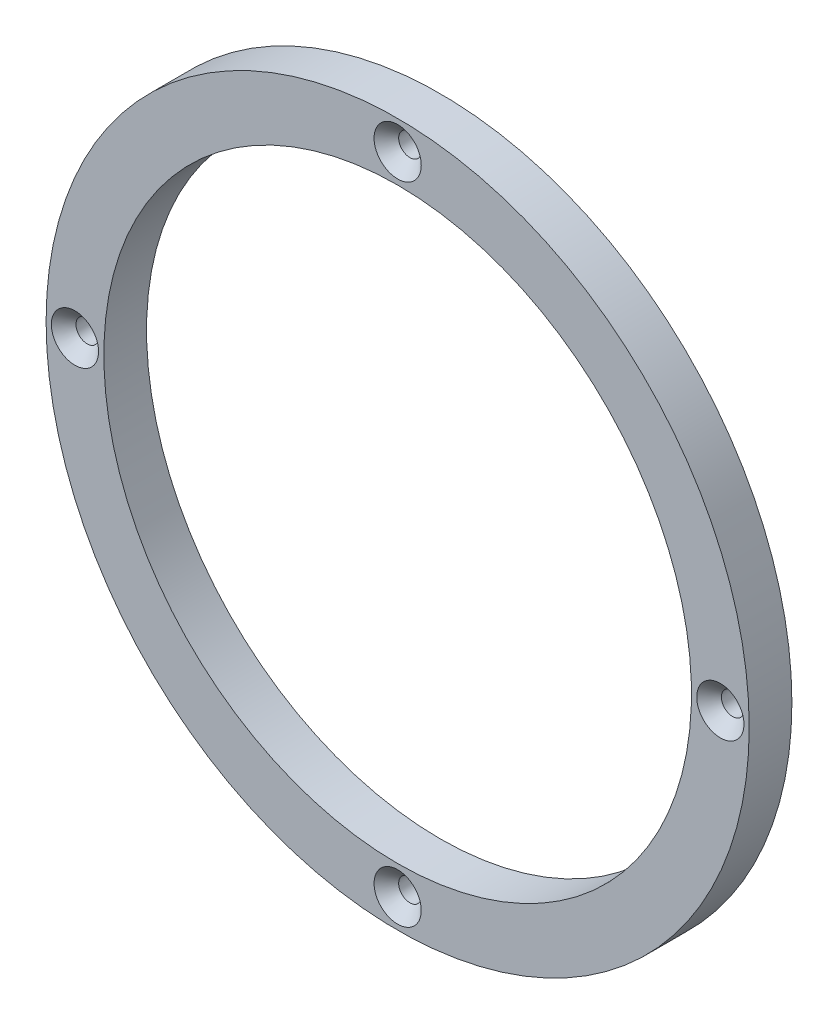
ISO-10303-21;
HEADER;
FILE_DESCRIPTION(('STEP AP214'),'2;1');
FILE_NAME('part.step','',(''),(''),'','','');
FILE_SCHEMA(('AUTOMOTIVE_DESIGN { 1 0 10303 214 1 1 1 1 }'));
ENDSEC;
DATA;
#1=APPLICATION_CONTEXT('core data for automotive mechanical design processes');
#2=APPLICATION_PROTOCOL_DEFINITION('international standard','automotive_design',2000,#1);
#3=PRODUCT_CONTEXT('',#1,'mechanical');
#4=PRODUCT('Part','Part','',(#3));
#5=PRODUCT_RELATED_PRODUCT_CATEGORY('part','',(#4));
#6=PRODUCT_DEFINITION_FORMATION('','',#4);
#7=PRODUCT_DEFINITION_CONTEXT('part definition',#1,'design');
#8=PRODUCT_DEFINITION('design','',#6,#7);
#9=PRODUCT_DEFINITION_SHAPE('','',#8);
#10=(LENGTH_UNIT() NAMED_UNIT(*) SI_UNIT(.MILLI.,.METRE.));
#11=(NAMED_UNIT(*) PLANE_ANGLE_UNIT() SI_UNIT($,.RADIAN.));
#12=(NAMED_UNIT(*) SI_UNIT($,.STERADIAN.) SOLID_ANGLE_UNIT());
#13=UNCERTAINTY_MEASURE_WITH_UNIT(LENGTH_MEASURE(1.E-05),#10,'distance_accuracy_value','');
#14=(GEOMETRIC_REPRESENTATION_CONTEXT(3) GLOBAL_UNCERTAINTY_ASSIGNED_CONTEXT((#13)) GLOBAL_UNIT_ASSIGNED_CONTEXT((#10,
#11,#12)) REPRESENTATION_CONTEXT('',''));
#15=CARTESIAN_POINT('',(0.,0.,0.));
#16=DIRECTION('',(0.,0.,1.));
#17=DIRECTION('',(1.,0.,0.));
#18=AXIS2_PLACEMENT_3D('',#15,#16,#17);
#19=CARTESIAN_POINT('',(0.,0.,8.5));
#20=DIRECTION('',(0.,0.,1.));
#21=DIRECTION('',(1.,0.,0.));
#22=AXIS2_PLACEMENT_3D('',#19,#20,#21);
#23=PLANE('',#22);
#24=CARTESIAN_POINT('',(64.25,0.,8.5));
#25=DIRECTION('',(0.,0.,1.));
#26=DIRECTION('',(1.,0.,0.));
#27=AXIS2_PLACEMENT_3D('',#24,#25,#26);
#28=CIRCLE('',#27,4.7);
#29=CARTESIAN_POINT('',(68.95,0.,8.5));
#30=VERTEX_POINT('',#29);
#31=EDGE_CURVE('E98',#30,#30,#28,.T.);
#32=ORIENTED_EDGE('',*,*,#31,.F.);
#33=EDGE_LOOP('',(#32));
#34=FACE_BOUND('',#33,.T.);
#35=CARTESIAN_POINT('',(0.,-64.25,8.5));
#36=DIRECTION('',(0.,0.,1.));
#37=DIRECTION('',(1.,0.,0.));
#38=AXIS2_PLACEMENT_3D('',#35,#36,#37);
#39=CIRCLE('',#38,4.7);
#40=CARTESIAN_POINT('',(4.7,-64.25,8.5));
#41=VERTEX_POINT('',#40);
#42=EDGE_CURVE('E89',#41,#41,#39,.T.);
#43=ORIENTED_EDGE('',*,*,#42,.F.);
#44=EDGE_LOOP('',(#43));
#45=FACE_BOUND('',#44,.T.);
#46=CARTESIAN_POINT('',(0.,64.25,8.5));
#47=DIRECTION('',(0.,0.,1.));
#48=DIRECTION('',(1.,0.,0.));
#49=AXIS2_PLACEMENT_3D('',#46,#47,#48);
#50=CIRCLE('',#49,4.7);
#51=CARTESIAN_POINT('',(4.7,64.25,8.5));
#52=VERTEX_POINT('',#51);
#53=EDGE_CURVE('E80',#52,#52,#50,.T.);
#54=ORIENTED_EDGE('',*,*,#53,.F.);
#55=EDGE_LOOP('',(#54));
#56=FACE_BOUND('',#55,.T.);
#57=CARTESIAN_POINT('',(-64.25,0.,8.5));
#58=DIRECTION('',(0.,0.,1.));
#59=DIRECTION('',(1.,0.,0.));
#60=AXIS2_PLACEMENT_3D('',#57,#58,#59);
#61=CIRCLE('',#60,4.7);
#62=CARTESIAN_POINT('',(-59.55,0.,8.5));
#63=VERTEX_POINT('',#62);
#64=EDGE_CURVE('E68',#63,#63,#61,.T.);
#65=ORIENTED_EDGE('',*,*,#64,.F.);
#66=EDGE_LOOP('',(#65));
#67=FACE_BOUND('',#66,.T.);
#68=CARTESIAN_POINT('',(0.,0.,8.5));
#69=DIRECTION('',(0.,0.,1.));
#70=DIRECTION('',(0.,1.,0.));
#71=AXIS2_PLACEMENT_3D('',#68,#69,#70);
#72=CIRCLE('',#71,58.5);
#73=CARTESIAN_POINT('',(0.,58.5,8.5));
#74=VERTEX_POINT('',#73);
#75=EDGE_CURVE('E10',#74,#74,#72,.T.);
#76=ORIENTED_EDGE('',*,*,#75,.F.);
#77=EDGE_LOOP('',(#76));
#78=FACE_BOUND('',#77,.T.);
#79=CARTESIAN_POINT('',(0.,0.,8.5));
#80=DIRECTION('',(0.,0.,1.));
#81=DIRECTION('',(1.,0.,0.));
#82=AXIS2_PLACEMENT_3D('',#79,#80,#81);
#83=CIRCLE('',#82,70.);
#84=CARTESIAN_POINT('',(70.,0.,8.5));
#85=VERTEX_POINT('',#84);
#86=EDGE_CURVE('E55',#85,#85,#83,.T.);
#87=ORIENTED_EDGE('',*,*,#86,.T.);
#88=EDGE_LOOP('',(#87));
#89=FACE_BOUND('',#88,.T.);
#90=ADVANCED_FACE('F39',(#34,#45,#56,#67,#78,#89),#23,.T.);
#91=CARTESIAN_POINT('',(0.,0.,0.));
#92=DIRECTION('',(0.,0.,1.));
#93=DIRECTION('',(1.,0.,0.));
#94=AXIS2_PLACEMENT_3D('',#91,#92,#93);
#95=PLANE('',#94);
#96=CARTESIAN_POINT('',(64.25,0.,0.));
#97=DIRECTION('',(0.,0.,1.));
#98=DIRECTION('',(1.,0.,0.));
#99=AXIS2_PLACEMENT_3D('',#96,#97,#98);
#100=CIRCLE('',#99,2.25);
#101=CARTESIAN_POINT('',(66.5,0.,0.));
#102=VERTEX_POINT('',#101);
#103=EDGE_CURVE('E92',#102,#102,#100,.T.);
#104=ORIENTED_EDGE('',*,*,#103,.T.);
#105=EDGE_LOOP('',(#104));
#106=FACE_BOUND('',#105,.T.);
#107=CARTESIAN_POINT('',(0.,-64.25,0.));
#108=DIRECTION('',(0.,0.,1.));
#109=DIRECTION('',(1.,0.,0.));
#110=AXIS2_PLACEMENT_3D('',#107,#108,#109);
#111=CIRCLE('',#110,2.25);
#112=CARTESIAN_POINT('',(2.25,-64.25,0.));
#113=VERTEX_POINT('',#112);
#114=EDGE_CURVE('E83',#113,#113,#111,.T.);
#115=ORIENTED_EDGE('',*,*,#114,.T.);
#116=EDGE_LOOP('',(#115));
#117=FACE_BOUND('',#116,.T.);
#118=CARTESIAN_POINT('',(0.,64.25,0.));
#119=DIRECTION('',(0.,0.,1.));
#120=DIRECTION('',(1.,0.,0.));
#121=AXIS2_PLACEMENT_3D('',#118,#119,#120);
#122=CIRCLE('',#121,2.25);
#123=CARTESIAN_POINT('',(2.25,64.25,0.));
#124=VERTEX_POINT('',#123);
#125=EDGE_CURVE('E72',#124,#124,#122,.T.);
#126=ORIENTED_EDGE('',*,*,#125,.T.);
#127=EDGE_LOOP('',(#126));
#128=FACE_BOUND('',#127,.T.);
#129=CARTESIAN_POINT('',(-64.25,0.,0.));
#130=DIRECTION('',(0.,0.,1.));
#131=DIRECTION('',(1.,0.,0.));
#132=AXIS2_PLACEMENT_3D('',#129,#130,#131);
#133=CIRCLE('',#132,2.25);
#134=CARTESIAN_POINT('',(-62.,0.,0.));
#135=VERTEX_POINT('',#134);
#136=EDGE_CURVE('E58',#135,#135,#133,.T.);
#137=ORIENTED_EDGE('',*,*,#136,.T.);
#138=EDGE_LOOP('',(#137));
#139=FACE_BOUND('',#138,.T.);
#140=CARTESIAN_POINT('',(0.,0.,0.));
#141=DIRECTION('',(0.,0.,1.));
#142=DIRECTION('',(0.,1.,0.));
#143=AXIS2_PLACEMENT_3D('',#140,#141,#142);
#144=CIRCLE('',#143,58.5);
#145=CARTESIAN_POINT('',(0.,58.5,0.));
#146=VERTEX_POINT('',#145);
#147=EDGE_CURVE('E50',#146,#146,#144,.T.);
#148=ORIENTED_EDGE('',*,*,#147,.T.);
#149=EDGE_LOOP('',(#148));
#150=FACE_BOUND('',#149,.T.);
#151=CARTESIAN_POINT('',(0.,0.,0.));
#152=DIRECTION('',(0.,0.,1.));
#153=DIRECTION('',(1.,0.,0.));
#154=AXIS2_PLACEMENT_3D('',#151,#152,#153);
#155=CIRCLE('',#154,70.);
#156=CARTESIAN_POINT('',(70.,0.,0.));
#157=VERTEX_POINT('',#156);
#158=EDGE_CURVE('E46',#157,#157,#155,.T.);
#159=ORIENTED_EDGE('',*,*,#158,.F.);
#160=EDGE_LOOP('',(#159));
#161=FACE_BOUND('',#160,.T.);
#162=ADVANCED_FACE('F41',(#106,#117,#128,#139,#150,#161),#95,.F.);
#163=CARTESIAN_POINT('',(0.,0.,8.5));
#164=DIRECTION('',(0.,0.,-1.));
#165=DIRECTION('',(-1.,0.,0.));
#166=AXIS2_PLACEMENT_3D('',#163,#164,#165);
#167=CYLINDRICAL_SURFACE('',#166,70.);
#168=ORIENTED_EDGE('',*,*,#86,.F.);
#169=EDGE_LOOP('',(#168));
#170=FACE_BOUND('',#169,.T.);
#171=ORIENTED_EDGE('',*,*,#158,.T.);
#172=EDGE_LOOP('',(#171));
#173=FACE_BOUND('',#172,.T.);
#174=ADVANCED_FACE('F132',(#170,#173),#167,.T.);
#175=CARTESIAN_POINT('',(0.,0.,8.5));
#176=DIRECTION('',(0.,0.,-1.));
#177=DIRECTION('',(-1.,0.,0.));
#178=AXIS2_PLACEMENT_3D('',#175,#176,#177);
#179=CYLINDRICAL_SURFACE('',#178,58.5);
#180=ORIENTED_EDGE('',*,*,#75,.T.);
#181=EDGE_LOOP('',(#180));
#182=FACE_BOUND('',#181,.T.);
#183=ORIENTED_EDGE('',*,*,#147,.F.);
#184=EDGE_LOOP('',(#183));
#185=FACE_BOUND('',#184,.T.);
#186=ADVANCED_FACE('F127',(#182,#185),#179,.F.);
#187=CARTESIAN_POINT('',(-64.25,0.,8.5));
#188=DIRECTION('',(0.,0.,1.));
#189=DIRECTION('',(1.,0.,0.));
#190=AXIS2_PLACEMENT_3D('',#187,#188,#189);
#191=CYLINDRICAL_SURFACE('',#190,2.25);
#192=ORIENTED_EDGE('',*,*,#136,.F.);
#193=EDGE_LOOP('',(#192));
#194=FACE_BOUND('',#193,.T.);
#195=CARTESIAN_POINT('',(-64.25,0.,6.05));
#196=DIRECTION('',(0.,0.,1.));
#197=DIRECTION('',(1.,0.,0.));
#198=AXIS2_PLACEMENT_3D('',#195,#196,#197);
#199=CIRCLE('',#198,2.25);
#200=CARTESIAN_POINT('',(-62.,0.,6.05));
#201=VERTEX_POINT('',#200);
#202=EDGE_CURVE('E64',#201,#201,#199,.T.);
#203=ORIENTED_EDGE('',*,*,#202,.T.);
#204=EDGE_LOOP('',(#203));
#205=FACE_BOUND('',#204,.T.);
#206=ADVANCED_FACE('F116',(#194,#205),#191,.F.);
#207=CARTESIAN_POINT('',(-64.25,0.,8.5));
#208=DIRECTION('',(0.,0.,1.));
#209=DIRECTION('',(1.,0.,0.));
#210=AXIS2_PLACEMENT_3D('',#207,#208,#209);
#211=CONICAL_SURFACE('',#210,4.7,0.785398163397449);
#212=ORIENTED_EDGE('',*,*,#202,.F.);
#213=EDGE_LOOP('',(#212));
#214=FACE_BOUND('',#213,.T.);
#215=ORIENTED_EDGE('',*,*,#64,.T.);
#216=EDGE_LOOP('',(#215));
#217=FACE_BOUND('',#216,.T.);
#218=ADVANCED_FACE('F113',(#214,#217),#211,.F.);
#219=CARTESIAN_POINT('',(0.,64.25,8.5));
#220=DIRECTION('',(0.,0.,1.));
#221=DIRECTION('',(1.,0.,0.));
#222=AXIS2_PLACEMENT_3D('',#219,#220,#221);
#223=CYLINDRICAL_SURFACE('',#222,2.25);
#224=ORIENTED_EDGE('',*,*,#125,.F.);
#225=EDGE_LOOP('',(#224));
#226=FACE_BOUND('',#225,.T.);
#227=CARTESIAN_POINT('',(0.,64.25,6.05));
#228=DIRECTION('',(0.,0.,1.));
#229=DIRECTION('',(1.,0.,0.));
#230=AXIS2_PLACEMENT_3D('',#227,#228,#229);
#231=CIRCLE('',#230,2.25);
#232=CARTESIAN_POINT('',(2.25,64.25,6.05));
#233=VERTEX_POINT('',#232);
#234=EDGE_CURVE('E77',#233,#233,#231,.T.);
#235=ORIENTED_EDGE('',*,*,#234,.T.);
#236=EDGE_LOOP('',(#235));
#237=FACE_BOUND('',#236,.T.);
#238=ADVANCED_FACE('F115',(#226,#237),#223,.F.);
#239=CARTESIAN_POINT('',(0.,64.25,8.5));
#240=DIRECTION('',(0.,0.,1.));
#241=DIRECTION('',(1.,0.,0.));
#242=AXIS2_PLACEMENT_3D('',#239,#240,#241);
#243=CONICAL_SURFACE('',#242,4.7,0.785398163397449);
#244=ORIENTED_EDGE('',*,*,#234,.F.);
#245=EDGE_LOOP('',(#244));
#246=FACE_BOUND('',#245,.T.);
#247=ORIENTED_EDGE('',*,*,#53,.T.);
#248=EDGE_LOOP('',(#247));
#249=FACE_BOUND('',#248,.T.);
#250=ADVANCED_FACE('F124',(#246,#249),#243,.F.);
#251=CARTESIAN_POINT('',(0.,-64.25,8.5));
#252=DIRECTION('',(0.,0.,1.));
#253=DIRECTION('',(1.,0.,0.));
#254=AXIS2_PLACEMENT_3D('',#251,#252,#253);
#255=CYLINDRICAL_SURFACE('',#254,2.25);
#256=ORIENTED_EDGE('',*,*,#114,.F.);
#257=EDGE_LOOP('',(#256));
#258=FACE_BOUND('',#257,.T.);
#259=CARTESIAN_POINT('',(0.,-64.25,6.05));
#260=DIRECTION('',(0.,0.,1.));
#261=DIRECTION('',(1.,0.,0.));
#262=AXIS2_PLACEMENT_3D('',#259,#260,#261);
#263=CIRCLE('',#262,2.25);
#264=CARTESIAN_POINT('',(2.25,-64.25,6.05));
#265=VERTEX_POINT('',#264);
#266=EDGE_CURVE('E86',#265,#265,#263,.T.);
#267=ORIENTED_EDGE('',*,*,#266,.T.);
#268=EDGE_LOOP('',(#267));
#269=FACE_BOUND('',#268,.T.);
#270=ADVANCED_FACE('F159',(#258,#269),#255,.F.);
#271=CARTESIAN_POINT('',(0.,-64.25,8.5));
#272=DIRECTION('',(0.,0.,1.));
#273=DIRECTION('',(1.,0.,0.));
#274=AXIS2_PLACEMENT_3D('',#271,#272,#273);
#275=CONICAL_SURFACE('',#274,4.7,0.785398163397449);
#276=ORIENTED_EDGE('',*,*,#266,.F.);
#277=EDGE_LOOP('',(#276));
#278=FACE_BOUND('',#277,.T.);
#279=ORIENTED_EDGE('',*,*,#42,.T.);
#280=EDGE_LOOP('',(#279));
#281=FACE_BOUND('',#280,.T.);
#282=ADVANCED_FACE('F164',(#278,#281),#275,.F.);
#283=CARTESIAN_POINT('',(64.25,0.,8.5));
#284=DIRECTION('',(0.,0.,1.));
#285=DIRECTION('',(1.,0.,0.));
#286=AXIS2_PLACEMENT_3D('',#283,#284,#285);
#287=CYLINDRICAL_SURFACE('',#286,2.25);
#288=ORIENTED_EDGE('',*,*,#103,.F.);
#289=EDGE_LOOP('',(#288));
#290=FACE_BOUND('',#289,.T.);
#291=CARTESIAN_POINT('',(64.25,0.,6.05));
#292=DIRECTION('',(0.,0.,1.));
#293=DIRECTION('',(1.,0.,0.));
#294=AXIS2_PLACEMENT_3D('',#291,#292,#293);
#295=CIRCLE('',#294,2.25);
#296=CARTESIAN_POINT('',(66.5,0.,6.05));
#297=VERTEX_POINT('',#296);
#298=EDGE_CURVE('E95',#297,#297,#295,.T.);
#299=ORIENTED_EDGE('',*,*,#298,.T.);
#300=EDGE_LOOP('',(#299));
#301=FACE_BOUND('',#300,.T.);
#302=ADVANCED_FACE('F170',(#290,#301),#287,.F.);
#303=CARTESIAN_POINT('',(64.25,0.,8.5));
#304=DIRECTION('',(0.,0.,1.));
#305=DIRECTION('',(1.,0.,0.));
#306=AXIS2_PLACEMENT_3D('',#303,#304,#305);
#307=CONICAL_SURFACE('',#306,4.7,0.785398163397447);
#308=ORIENTED_EDGE('',*,*,#298,.F.);
#309=EDGE_LOOP('',(#308));
#310=FACE_BOUND('',#309,.T.);
#311=ORIENTED_EDGE('',*,*,#31,.T.);
#312=EDGE_LOOP('',(#311));
#313=FACE_BOUND('',#312,.T.);
#314=ADVANCED_FACE('F102',(#310,#313),#307,.F.);
#315=CLOSED_SHELL('',(#90,#162,#174,#186,#206,#218,#238,#250,#270,#282,#302,#314));
#316=MANIFOLD_SOLID_BREP('B2',#315);
#317=ADVANCED_BREP_SHAPE_REPRESENTATION('',(#18,#316),#14);
#318=SHAPE_DEFINITION_REPRESENTATION(#9,#317);
ENDSEC;
END-ISO-10303-21;
